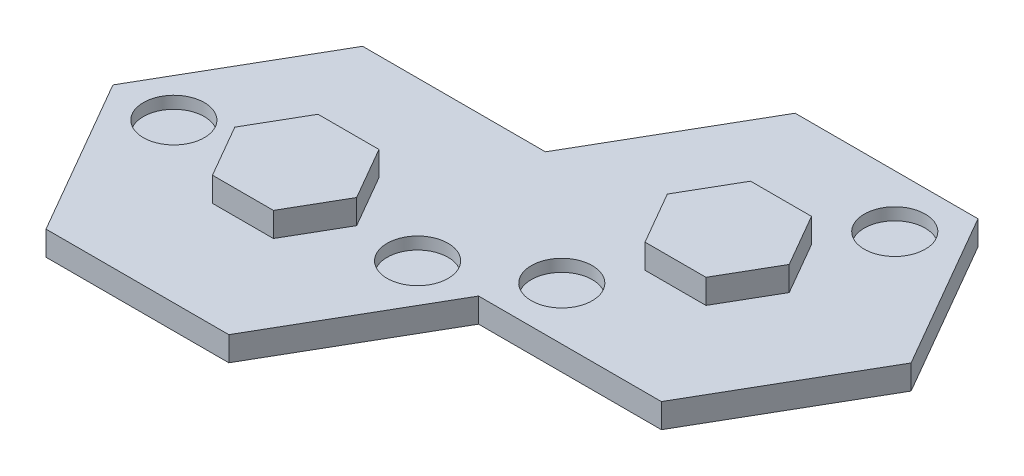
ISO-10303-21;
HEADER;
FILE_DESCRIPTION(('STEP AP214'),'2;1');
FILE_NAME('part.step','',(''),(''),'','','');
FILE_SCHEMA(('AUTOMOTIVE_DESIGN { 1 0 10303 214 1 1 1 1 }'));
ENDSEC;
DATA;
#1=APPLICATION_CONTEXT('core data for automotive mechanical design processes');
#2=APPLICATION_PROTOCOL_DEFINITION('international standard','automotive_design',2000,#1);
#3=PRODUCT_CONTEXT('',#1,'mechanical');
#4=PRODUCT('Part','Part','',(#3));
#5=PRODUCT_RELATED_PRODUCT_CATEGORY('part','',(#4));
#6=PRODUCT_DEFINITION_FORMATION('','',#4);
#7=PRODUCT_DEFINITION_CONTEXT('part definition',#1,'design');
#8=PRODUCT_DEFINITION('design','',#6,#7);
#9=PRODUCT_DEFINITION_SHAPE('','',#8);
#10=(LENGTH_UNIT() NAMED_UNIT(*) SI_UNIT(.MILLI.,.METRE.));
#11=(NAMED_UNIT(*) PLANE_ANGLE_UNIT() SI_UNIT($,.RADIAN.));
#12=(NAMED_UNIT(*) SI_UNIT($,.STERADIAN.) SOLID_ANGLE_UNIT());
#13=UNCERTAINTY_MEASURE_WITH_UNIT(LENGTH_MEASURE(1.E-05),#10,'distance_accuracy_value','');
#14=(GEOMETRIC_REPRESENTATION_CONTEXT(3) GLOBAL_UNCERTAINTY_ASSIGNED_CONTEXT((#13)) GLOBAL_UNIT_ASSIGNED_CONTEXT((#10,
#11,#12)) REPRESENTATION_CONTEXT('',''));
#15=CARTESIAN_POINT('',(0.,0.,0.));
#16=DIRECTION('',(0.,0.,1.));
#17=DIRECTION('',(1.,0.,0.));
#18=AXIS2_PLACEMENT_3D('',#15,#16,#17);
#19=CARTESIAN_POINT('',(0.,10.16,0.));
#20=DIRECTION('',(0.,1.,0.));
#21=DIRECTION('',(0.,0.,1.));
#22=AXIS2_PLACEMENT_3D('',#19,#20,#21);
#23=PLANE('',#22);
#24=DIRECTION('',(-0.500000000000001,0.,-0.866025403784438));
#25=VECTOR('',#24,1.);
#26=CARTESIAN_POINT('',(101.6,10.1600000000002,-43.9940905122495));
#27=LINE('',#26,#25);
#28=CARTESIAN_POINT('',(101.6,10.16,-43.9940905122495));
#29=VERTEX_POINT('',#28);
#30=CARTESIAN_POINT('',(88.9,10.1600000000002,-65.9911357683742));
#31=VERTEX_POINT('',#30);
#32=EDGE_CURVE('E187',#29,#31,#27,.T.);
#33=ORIENTED_EDGE('',*,*,#32,.T.);
#34=DIRECTION('',(0.499999999999999,0.,-0.866025403784439));
#35=VECTOR('',#34,1.);
#36=CARTESIAN_POINT('',(88.9,10.1600000000002,-65.9911357683742));
#37=LINE('',#36,#35);
#38=CARTESIAN_POINT('',(101.6,10.16,-87.9881810244989));
#39=VERTEX_POINT('',#38);
#40=EDGE_CURVE('E202',#31,#39,#37,.T.);
#41=ORIENTED_EDGE('',*,*,#40,.T.);
#42=DIRECTION('',(1.,0.,0.));
#43=VECTOR('',#42,1.);
#44=CARTESIAN_POINT('',(101.6,10.1600000000004,-87.988181024499));
#45=LINE('',#44,#43);
#46=CARTESIAN_POINT('',(127.,10.16,-87.988181024499));
#47=VERTEX_POINT('',#46);
#48=EDGE_CURVE('E222',#39,#47,#45,.T.);
#49=ORIENTED_EDGE('',*,*,#48,.T.);
#50=DIRECTION('',(0.5,0.,0.866025403784438));
#51=VECTOR('',#50,1.);
#52=CARTESIAN_POINT('',(127.,10.1600000000005,-87.988181024499));
#53=LINE('',#52,#51);
#54=CARTESIAN_POINT('',(139.7,10.16,-65.9911357683742));
#55=VERTEX_POINT('',#54);
#56=EDGE_CURVE('E220',#47,#55,#53,.T.);
#57=ORIENTED_EDGE('',*,*,#56,.T.);
#58=DIRECTION('',(-0.499999999999999,0.,0.866025403784439));
#59=VECTOR('',#58,1.);
#60=CARTESIAN_POINT('',(139.7,10.1600000000005,-65.9911357683742));
#61=LINE('',#60,#59);
#62=CARTESIAN_POINT('',(127.,10.16,-43.9940905122495));
#63=VERTEX_POINT('',#62);
#64=EDGE_CURVE('E53',#55,#63,#61,.T.);
#65=ORIENTED_EDGE('',*,*,#64,.T.);
#66=DIRECTION('',(-1.,0.,0.));
#67=VECTOR('',#66,1.);
#68=CARTESIAN_POINT('',(127.,10.1600000000004,-43.9940905122495));
#69=LINE('',#68,#67);
#70=EDGE_CURVE('E48',#63,#29,#69,.T.);
#71=ORIENTED_EDGE('',*,*,#70,.T.);
#72=EDGE_LOOP('',(#33,#41,#49,#57,#65,#71));
#73=FACE_BOUND('',#72,.T.);
#74=CARTESIAN_POINT('',(139.7,10.16,-109.985226280624));
#75=DIRECTION('',(0.,-1.,0.));
#76=DIRECTION('',(0.866025403784439,0.,0.5));
#77=AXIS2_PLACEMENT_3D('',#74,#75,#76);
#78=CIRCLE('',#77,12.7);
#79=CARTESIAN_POINT('',(150.698522628062,10.16,-103.635226280624));
#80=VERTEX_POINT('',#79);
#81=EDGE_CURVE('E283',#80,#80,#78,.T.);
#82=ORIENTED_EDGE('',*,*,#81,.T.);
#83=EDGE_LOOP('',(#82));
#84=FACE_BOUND('',#83,.T.);
#85=CARTESIAN_POINT('',(88.9,10.16,-21.9970452561248));
#86=DIRECTION('',(0.,-1.,0.));
#87=DIRECTION('',(-0.866025403784439,0.,-0.5));
#88=AXIS2_PLACEMENT_3D('',#85,#86,#87);
#89=CIRCLE('',#88,12.7);
#90=CARTESIAN_POINT('',(77.9014773719377,10.16,-28.3470452561248));
#91=VERTEX_POINT('',#90);
#92=EDGE_CURVE('E278',#91,#91,#89,.T.);
#93=ORIENTED_EDGE('',*,*,#92,.T.);
#94=EDGE_LOOP('',(#93));
#95=FACE_BOUND('',#94,.T.);
#96=CARTESIAN_POINT('',(-50.8,10.16,0.));
#97=DIRECTION('',(0.,1.,0.));
#98=DIRECTION('',(0.,0.,1.));
#99=AXIS2_PLACEMENT_3D('',#96,#97,#98);
#100=CIRCLE('',#99,12.7);
#101=CARTESIAN_POINT('',(-50.8,10.16,12.7));
#102=VERTEX_POINT('',#101);
#103=EDGE_CURVE('E333',#102,#102,#100,.T.);
#104=ORIENTED_EDGE('',*,*,#103,.F.);
#105=EDGE_LOOP('',(#104));
#106=FACE_BOUND('',#105,.T.);
#107=CARTESIAN_POINT('',(50.8,10.16,0.));
#108=DIRECTION('',(0.,1.,0.));
#109=DIRECTION('',(0.,0.,-1.));
#110=AXIS2_PLACEMENT_3D('',#107,#108,#109);
#111=CIRCLE('',#110,12.7);
#112=CARTESIAN_POINT('',(50.8,10.16,-12.7));
#113=VERTEX_POINT('',#112);
#114=EDGE_CURVE('E328',#113,#113,#111,.T.);
#115=ORIENTED_EDGE('',*,*,#114,.F.);
#116=EDGE_LOOP('',(#115));
#117=FACE_BOUND('',#116,.T.);
#118=DIRECTION('',(0.5,0.,-0.866025403784439));
#119=VECTOR('',#118,1.);
#120=CARTESIAN_POINT('',(38.1,10.16,65.9911357683742));
#121=LINE('',#120,#119);
#122=CARTESIAN_POINT('',(38.1,10.16,65.9911357683742));
#123=VERTEX_POINT('',#122);
#124=CARTESIAN_POINT('',(76.2,10.16,0.));
#125=VERTEX_POINT('',#124);
#126=EDGE_CURVE('E350',#123,#125,#121,.T.);
#127=ORIENTED_EDGE('',*,*,#126,.T.);
#128=DIRECTION('',(-1.,0.,0.));
#129=VECTOR('',#128,1.);
#130=CARTESIAN_POINT('',(152.4,10.16,0.));
#131=LINE('',#130,#129);
#132=CARTESIAN_POINT('',(152.4,10.16,0.));
#133=VERTEX_POINT('',#132);
#134=EDGE_CURVE('E291',#133,#125,#131,.T.);
#135=ORIENTED_EDGE('',*,*,#134,.F.);
#136=DIRECTION('',(-0.500000000000001,0.,0.866025403784438));
#137=VECTOR('',#136,1.);
#138=CARTESIAN_POINT('',(190.5,10.16,-65.9911357683742));
#139=LINE('',#138,#137);
#140=CARTESIAN_POINT('',(190.5,10.16,-65.9911357683742));
#141=VERTEX_POINT('',#140);
#142=EDGE_CURVE('E294',#141,#133,#139,.T.);
#143=ORIENTED_EDGE('',*,*,#142,.F.);
#144=DIRECTION('',(0.5,0.,0.866025403784439));
#145=VECTOR('',#144,1.);
#146=CARTESIAN_POINT('',(152.4,10.16,-131.982271536748));
#147=LINE('',#146,#145);
#148=CARTESIAN_POINT('',(152.4,10.16,-131.982271536748));
#149=VERTEX_POINT('',#148);
#150=EDGE_CURVE('E298',#149,#141,#147,.T.);
#151=ORIENTED_EDGE('',*,*,#150,.F.);
#152=DIRECTION('',(1.,0.,0.));
#153=VECTOR('',#152,1.);
#154=CARTESIAN_POINT('',(76.2000000000001,10.16,-131.982271536748));
#155=LINE('',#154,#153);
#156=CARTESIAN_POINT('',(76.2000000000001,10.16,-131.982271536748));
#157=VERTEX_POINT('',#156);
#158=EDGE_CURVE('E301',#157,#149,#155,.T.);
#159=ORIENTED_EDGE('',*,*,#158,.F.);
#160=DIRECTION('',(0.5,0.,-0.866025403784438));
#161=VECTOR('',#160,1.);
#162=CARTESIAN_POINT('',(38.1,10.16,-65.9911357683742));
#163=LINE('',#162,#161);
#164=CARTESIAN_POINT('',(38.1,10.16,-65.9911357683742));
#165=VERTEX_POINT('',#164);
#166=EDGE_CURVE('E304',#165,#157,#163,.T.);
#167=ORIENTED_EDGE('',*,*,#166,.F.);
#168=DIRECTION('',(-1.,0.,0.));
#169=VECTOR('',#168,1.);
#170=CARTESIAN_POINT('',(38.1,10.16,-65.9911357683742));
#171=LINE('',#170,#169);
#172=CARTESIAN_POINT('',(-38.1,10.16,-65.9911357683742));
#173=VERTEX_POINT('',#172);
#174=EDGE_CURVE('E341',#165,#173,#171,.T.);
#175=ORIENTED_EDGE('',*,*,#174,.T.);
#176=DIRECTION('',(-0.5,0.,0.866025403784439));
#177=VECTOR('',#176,1.);
#178=CARTESIAN_POINT('',(-38.1,10.16,-65.9911357683742));
#179=LINE('',#178,#177);
#180=CARTESIAN_POINT('',(-76.2,10.16,0.));
#181=VERTEX_POINT('',#180);
#182=EDGE_CURVE('E343',#173,#181,#179,.T.);
#183=ORIENTED_EDGE('',*,*,#182,.T.);
#184=DIRECTION('',(0.5,0.,0.866025403784439));
#185=VECTOR('',#184,1.);
#186=CARTESIAN_POINT('',(-76.2,10.16,0.));
#187=LINE('',#186,#185);
#188=CARTESIAN_POINT('',(-38.1,10.16,65.9911357683742));
#189=VERTEX_POINT('',#188);
#190=EDGE_CURVE('E346',#181,#189,#187,.T.);
#191=ORIENTED_EDGE('',*,*,#190,.T.);
#192=DIRECTION('',(1.,0.,0.));
#193=VECTOR('',#192,1.);
#194=CARTESIAN_POINT('',(-38.1,10.16,65.9911357683742));
#195=LINE('',#194,#193);
#196=EDGE_CURVE('E348',#189,#123,#195,.T.);
#197=ORIENTED_EDGE('',*,*,#196,.T.);
#198=EDGE_LOOP('',(#127,#135,#143,#151,#159,#167,#175,#183,#191,#197));
#199=FACE_BOUND('',#198,.T.);
#200=DIRECTION('',(-1.,0.,0.));
#201=VECTOR('',#200,1.);
#202=CARTESIAN_POINT('',(12.7,10.16,-21.9970452561247));
#203=LINE('',#202,#201);
#204=CARTESIAN_POINT('',(12.7,10.16,-21.9970452561247));
#205=VERTEX_POINT('',#204);
#206=CARTESIAN_POINT('',(-12.7,10.16,-21.9970452561247));
#207=VERTEX_POINT('',#206);
#208=EDGE_CURVE('E253',#205,#207,#203,.T.);
#209=ORIENTED_EDGE('',*,*,#208,.F.);
#210=DIRECTION('',(-0.5,0.,-0.866025403784439));
#211=VECTOR('',#210,1.);
#212=CARTESIAN_POINT('',(25.4,10.16,0.));
#213=LINE('',#212,#211);
#214=CARTESIAN_POINT('',(25.4,10.16,0.));
#215=VERTEX_POINT('',#214);
#216=EDGE_CURVE('E190',#215,#205,#213,.T.);
#217=ORIENTED_EDGE('',*,*,#216,.F.);
#218=DIRECTION('',(0.5,0.,-0.866025403784439));
#219=VECTOR('',#218,1.);
#220=CARTESIAN_POINT('',(12.7,10.16,21.9970452561248));
#221=LINE('',#220,#219);
#222=CARTESIAN_POINT('',(12.7,10.16,21.9970452561248));
#223=VERTEX_POINT('',#222);
#224=EDGE_CURVE('E240',#223,#215,#221,.T.);
#225=ORIENTED_EDGE('',*,*,#224,.F.);
#226=DIRECTION('',(1.,0.,0.));
#227=VECTOR('',#226,1.);
#228=CARTESIAN_POINT('',(-12.7,10.16,21.9970452561247));
#229=LINE('',#228,#227);
#230=CARTESIAN_POINT('',(-12.7,10.16,21.9970452561247));
#231=VERTEX_POINT('',#230);
#232=EDGE_CURVE('E259',#231,#223,#229,.T.);
#233=ORIENTED_EDGE('',*,*,#232,.F.);
#234=DIRECTION('',(0.5,0.,0.866025403784439));
#235=VECTOR('',#234,1.);
#236=CARTESIAN_POINT('',(-25.4,10.16,0.));
#237=LINE('',#236,#235);
#238=CARTESIAN_POINT('',(-25.4,10.16,0.));
#239=VERTEX_POINT('',#238);
#240=EDGE_CURVE('E257',#239,#231,#237,.T.);
#241=ORIENTED_EDGE('',*,*,#240,.F.);
#242=DIRECTION('',(-0.5,0.,0.866025403784439));
#243=VECTOR('',#242,1.);
#244=CARTESIAN_POINT('',(-12.7,10.16,-21.9970452561247));
#245=LINE('',#244,#243);
#246=EDGE_CURVE('E255',#207,#239,#245,.T.);
#247=ORIENTED_EDGE('',*,*,#246,.F.);
#248=EDGE_LOOP('',(#209,#217,#225,#233,#241,#247));
#249=FACE_BOUND('',#248,.T.);
#250=ADVANCED_FACE('F33',(#73,#84,#95,#106,#117,#199,#249),#23,.T.);
#251=CARTESIAN_POINT('',(38.1,10.16,-65.9911357683742));
#252=DIRECTION('',(0.,0.,1.));
#253=DIRECTION('',(1.,0.,0.));
#254=AXIS2_PLACEMENT_3D('',#251,#252,#253);
#255=PLANE('',#254);
#256=DIRECTION('',(-1.,0.,0.));
#257=VECTOR('',#256,1.);
#258=CARTESIAN_POINT('',(38.1,0.,-65.9911357683742));
#259=LINE('',#258,#257);
#260=CARTESIAN_POINT('',(38.1,0.,-65.9911357683742));
#261=VERTEX_POINT('',#260);
#262=CARTESIAN_POINT('',(-38.1,0.,-65.9911357683742));
#263=VERTEX_POINT('',#262);
#264=EDGE_CURVE('E332',#261,#263,#259,.T.);
#265=ORIENTED_EDGE('',*,*,#264,.T.);
#266=DIRECTION('',(0.,-1.,0.));
#267=VECTOR('',#266,1.);
#268=CARTESIAN_POINT('',(-38.1,10.16,-65.9911357683742));
#269=LINE('',#268,#267);
#270=EDGE_CURVE('E41',#173,#263,#269,.T.);
#271=ORIENTED_EDGE('',*,*,#270,.F.);
#272=ORIENTED_EDGE('',*,*,#174,.F.);
#273=DIRECTION('',(0.,-1.,0.));
#274=VECTOR('',#273,1.);
#275=CARTESIAN_POINT('',(38.1,10.16,-65.9911357683742));
#276=LINE('',#275,#274);
#277=EDGE_CURVE('E11',#165,#261,#276,.T.);
#278=ORIENTED_EDGE('',*,*,#277,.T.);
#279=EDGE_LOOP('',(#265,#271,#272,#278));
#280=FACE_BOUND('',#279,.T.);
#281=ADVANCED_FACE('F35',(#280),#255,.F.);
#282=CARTESIAN_POINT('',(-38.1,10.16,-65.9911357683742));
#283=DIRECTION('',(0.866025403784439,0.,0.5));
#284=DIRECTION('',(0.5,0.,-0.866025403784439));
#285=AXIS2_PLACEMENT_3D('',#282,#283,#284);
#286=PLANE('',#285);
#287=DIRECTION('',(-0.5,0.,0.866025403784439));
#288=VECTOR('',#287,1.);
#289=CARTESIAN_POINT('',(-38.1,0.,-65.9911357683742));
#290=LINE('',#289,#288);
#291=CARTESIAN_POINT('',(-76.2,0.,0.));
#292=VERTEX_POINT('',#291);
#293=EDGE_CURVE('E354',#263,#292,#290,.T.);
#294=ORIENTED_EDGE('',*,*,#293,.T.);
#295=DIRECTION('',(0.,-1.,0.));
#296=VECTOR('',#295,1.);
#297=CARTESIAN_POINT('',(-76.2,10.16,0.));
#298=LINE('',#297,#296);
#299=EDGE_CURVE('E369',#181,#292,#298,.T.);
#300=ORIENTED_EDGE('',*,*,#299,.F.);
#301=ORIENTED_EDGE('',*,*,#182,.F.);
#302=ORIENTED_EDGE('',*,*,#270,.T.);
#303=EDGE_LOOP('',(#294,#300,#301,#302));
#304=FACE_BOUND('',#303,.T.);
#305=ADVANCED_FACE('F376',(#304),#286,.F.);
#306=CARTESIAN_POINT('',(-76.2,10.16,0.));
#307=DIRECTION('',(0.866025403784439,0.,-0.5));
#308=DIRECTION('',(-0.5,0.,-0.866025403784439));
#309=AXIS2_PLACEMENT_3D('',#306,#307,#308);
#310=PLANE('',#309);
#311=DIRECTION('',(0.5,0.,0.866025403784439));
#312=VECTOR('',#311,1.);
#313=CARTESIAN_POINT('',(-76.2,0.,0.));
#314=LINE('',#313,#312);
#315=CARTESIAN_POINT('',(-38.1,0.,65.9911357683742));
#316=VERTEX_POINT('',#315);
#317=EDGE_CURVE('E356',#292,#316,#314,.T.);
#318=ORIENTED_EDGE('',*,*,#317,.T.);
#319=DIRECTION('',(0.,-1.,0.));
#320=VECTOR('',#319,1.);
#321=CARTESIAN_POINT('',(-38.1,10.16,65.9911357683742));
#322=LINE('',#321,#320);
#323=EDGE_CURVE('E366',#189,#316,#322,.T.);
#324=ORIENTED_EDGE('',*,*,#323,.F.);
#325=ORIENTED_EDGE('',*,*,#190,.F.);
#326=ORIENTED_EDGE('',*,*,#299,.T.);
#327=EDGE_LOOP('',(#318,#324,#325,#326));
#328=FACE_BOUND('',#327,.T.);
#329=ADVANCED_FACE('F386',(#328),#310,.F.);
#330=CARTESIAN_POINT('',(-38.1,10.16,65.9911357683742));
#331=DIRECTION('',(0.,0.,-1.));
#332=DIRECTION('',(-1.,0.,0.));
#333=AXIS2_PLACEMENT_3D('',#330,#331,#332);
#334=PLANE('',#333);
#335=DIRECTION('',(1.,0.,0.));
#336=VECTOR('',#335,1.);
#337=CARTESIAN_POINT('',(-38.1,0.,65.9911357683742));
#338=LINE('',#337,#336);
#339=CARTESIAN_POINT('',(38.1,0.,65.9911357683742));
#340=VERTEX_POINT('',#339);
#341=EDGE_CURVE('E358',#316,#340,#338,.T.);
#342=ORIENTED_EDGE('',*,*,#341,.T.);
#343=DIRECTION('',(0.,-1.,0.));
#344=VECTOR('',#343,1.);
#345=CARTESIAN_POINT('',(38.1,10.16,65.9911357683742));
#346=LINE('',#345,#344);
#347=EDGE_CURVE('E363',#123,#340,#346,.T.);
#348=ORIENTED_EDGE('',*,*,#347,.F.);
#349=ORIENTED_EDGE('',*,*,#196,.F.);
#350=ORIENTED_EDGE('',*,*,#323,.T.);
#351=EDGE_LOOP('',(#342,#348,#349,#350));
#352=FACE_BOUND('',#351,.T.);
#353=ADVANCED_FACE('F390',(#352),#334,.F.);
#354=CARTESIAN_POINT('',(38.1,10.16,65.9911357683742));
#355=DIRECTION('',(-0.866025403784439,0.,-0.5));
#356=DIRECTION('',(-0.5,0.,0.866025403784439));
#357=AXIS2_PLACEMENT_3D('',#354,#355,#356);
#358=PLANE('',#357);
#359=DIRECTION('',(0.5,0.,-0.866025403784439));
#360=VECTOR('',#359,1.);
#361=CARTESIAN_POINT('',(38.1,0.,65.9911357683742));
#362=LINE('',#361,#360);
#363=CARTESIAN_POINT('',(76.2,0.,0.));
#364=VERTEX_POINT('',#363);
#365=EDGE_CURVE('E344',#340,#364,#362,.T.);
#366=ORIENTED_EDGE('',*,*,#365,.T.);
#367=DIRECTION('',(0.,-1.,0.));
#368=VECTOR('',#367,1.);
#369=CARTESIAN_POINT('',(76.2,10.16,0.));
#370=LINE('',#369,#368);
#371=EDGE_CURVE('E352',#125,#364,#370,.T.);
#372=ORIENTED_EDGE('',*,*,#371,.F.);
#373=ORIENTED_EDGE('',*,*,#126,.F.);
#374=ORIENTED_EDGE('',*,*,#347,.T.);
#375=EDGE_LOOP('',(#366,#372,#373,#374));
#376=FACE_BOUND('',#375,.T.);
#377=ADVANCED_FACE('F418',(#376),#358,.F.);
#378=CARTESIAN_POINT('',(0.,0.,0.));
#379=DIRECTION('',(0.,1.,0.));
#380=DIRECTION('',(0.,0.,1.));
#381=AXIS2_PLACEMENT_3D('',#378,#379,#380);
#382=PLANE('',#381);
#383=ORIENTED_EDGE('',*,*,#264,.F.);
#384=DIRECTION('',(0.5,0.,-0.866025403784438));
#385=VECTOR('',#384,1.);
#386=CARTESIAN_POINT('',(38.1,0.,-65.9911357683742));
#387=LINE('',#386,#385);
#388=CARTESIAN_POINT('',(76.2000000000001,0.,-131.982271536748));
#389=VERTEX_POINT('',#388);
#390=EDGE_CURVE('E295',#261,#389,#387,.T.);
#391=ORIENTED_EDGE('',*,*,#390,.T.);
#392=DIRECTION('',(1.,0.,0.));
#393=VECTOR('',#392,1.);
#394=CARTESIAN_POINT('',(76.2000000000001,0.,-131.982271536748));
#395=LINE('',#394,#393);
#396=CARTESIAN_POINT('',(152.4,0.,-131.982271536748));
#397=VERTEX_POINT('',#396);
#398=EDGE_CURVE('E316',#389,#397,#395,.T.);
#399=ORIENTED_EDGE('',*,*,#398,.T.);
#400=DIRECTION('',(0.5,0.,0.866025403784439));
#401=VECTOR('',#400,1.);
#402=CARTESIAN_POINT('',(152.4,0.,-131.982271536748));
#403=LINE('',#402,#401);
#404=CARTESIAN_POINT('',(190.5,0.,-65.9911357683742));
#405=VERTEX_POINT('',#404);
#406=EDGE_CURVE('E313',#397,#405,#403,.T.);
#407=ORIENTED_EDGE('',*,*,#406,.T.);
#408=DIRECTION('',(-0.500000000000001,0.,0.866025403784438));
#409=VECTOR('',#408,1.);
#410=CARTESIAN_POINT('',(190.5,0.,-65.9911357683742));
#411=LINE('',#410,#409);
#412=CARTESIAN_POINT('',(152.4,0.,0.));
#413=VERTEX_POINT('',#412);
#414=EDGE_CURVE('E310',#405,#413,#411,.T.);
#415=ORIENTED_EDGE('',*,*,#414,.T.);
#416=DIRECTION('',(-1.,0.,0.));
#417=VECTOR('',#416,1.);
#418=CARTESIAN_POINT('',(152.4,0.,0.));
#419=LINE('',#418,#417);
#420=EDGE_CURVE('E282',#413,#364,#419,.T.);
#421=ORIENTED_EDGE('',*,*,#420,.T.);
#422=ORIENTED_EDGE('',*,*,#365,.F.);
#423=ORIENTED_EDGE('',*,*,#341,.F.);
#424=ORIENTED_EDGE('',*,*,#317,.F.);
#425=ORIENTED_EDGE('',*,*,#293,.F.);
#426=EDGE_LOOP('',(#383,#391,#399,#407,#415,#421,#422,#423,#424,#425));
#427=FACE_BOUND('',#426,.T.);
#428=ADVANCED_FACE('F381',(#427),#382,.F.);
#429=CARTESIAN_POINT('',(50.8,5.08,0.));
#430=DIRECTION('',(0.,1.,0.));
#431=DIRECTION('',(0.,0.,1.));
#432=AXIS2_PLACEMENT_3D('',#429,#430,#431);
#433=CYLINDRICAL_SURFACE('',#432,12.7);
#434=CARTESIAN_POINT('',(50.8,5.08,0.));
#435=DIRECTION('',(0.,1.,0.));
#436=DIRECTION('',(0.,0.,-1.));
#437=AXIS2_PLACEMENT_3D('',#434,#435,#436);
#438=CIRCLE('',#437,12.7);
#439=CARTESIAN_POINT('',(50.8,5.08,-12.7));
#440=VERTEX_POINT('',#439);
#441=EDGE_CURVE('E336',#440,#440,#438,.T.);
#442=ORIENTED_EDGE('',*,*,#441,.F.);
#443=EDGE_LOOP('',(#442));
#444=FACE_BOUND('',#443,.T.);
#445=ORIENTED_EDGE('',*,*,#114,.T.);
#446=EDGE_LOOP('',(#445));
#447=FACE_BOUND('',#446,.T.);
#448=ADVANCED_FACE('F425',(#444,#447),#433,.F.);
#449=CARTESIAN_POINT('',(50.8,5.08,0.));
#450=DIRECTION('',(0.,-1.,0.));
#451=DIRECTION('',(0.,0.,-1.));
#452=AXIS2_PLACEMENT_3D('',#449,#450,#451);
#453=PLANE('',#452);
#454=ORIENTED_EDGE('',*,*,#441,.T.);
#455=EDGE_LOOP('',(#454));
#456=FACE_BOUND('',#455,.T.);
#457=ADVANCED_FACE('F437',(#456),#453,.F.);
#458=CARTESIAN_POINT('',(-50.8,5.08,0.));
#459=DIRECTION('',(0.,1.,0.));
#460=DIRECTION('',(0.,0.,1.));
#461=AXIS2_PLACEMENT_3D('',#458,#459,#460);
#462=CYLINDRICAL_SURFACE('',#461,12.7);
#463=CARTESIAN_POINT('',(-50.8,5.08,0.));
#464=DIRECTION('',(0.,1.,0.));
#465=DIRECTION('',(0.,0.,1.));
#466=AXIS2_PLACEMENT_3D('',#463,#464,#465);
#467=CIRCLE('',#466,12.7);
#468=CARTESIAN_POINT('',(-50.8,5.08,12.7));
#469=VERTEX_POINT('',#468);
#470=EDGE_CURVE('E329',#469,#469,#467,.T.);
#471=ORIENTED_EDGE('',*,*,#470,.F.);
#472=EDGE_LOOP('',(#471));
#473=FACE_BOUND('',#472,.T.);
#474=ORIENTED_EDGE('',*,*,#103,.T.);
#475=EDGE_LOOP('',(#474));
#476=FACE_BOUND('',#475,.T.);
#477=ADVANCED_FACE('F441',(#473,#476),#462,.F.);
#478=CARTESIAN_POINT('',(-50.8,5.08,0.));
#479=DIRECTION('',(0.,1.,0.));
#480=DIRECTION('',(0.,0.,1.));
#481=AXIS2_PLACEMENT_3D('',#478,#479,#480);
#482=PLANE('',#481);
#483=ORIENTED_EDGE('',*,*,#470,.T.);
#484=EDGE_LOOP('',(#483));
#485=FACE_BOUND('',#484,.T.);
#486=ADVANCED_FACE('F445',(#485),#482,.T.);
#487=CARTESIAN_POINT('',(152.4,10.16,0.));
#488=DIRECTION('',(0.,0.,1.));
#489=DIRECTION('',(1.,0.,0.));
#490=AXIS2_PLACEMENT_3D('',#487,#488,#489);
#491=PLANE('',#490);
#492=ORIENTED_EDGE('',*,*,#420,.F.);
#493=DIRECTION('',(0.,-1.,0.));
#494=VECTOR('',#493,1.);
#495=CARTESIAN_POINT('',(152.4,10.16,0.));
#496=LINE('',#495,#494);
#497=EDGE_CURVE('E326',#133,#413,#496,.T.);
#498=ORIENTED_EDGE('',*,*,#497,.F.);
#499=ORIENTED_EDGE('',*,*,#134,.T.);
#500=ORIENTED_EDGE('',*,*,#371,.T.);
#501=EDGE_LOOP('',(#492,#498,#499,#500));
#502=FACE_BOUND('',#501,.T.);
#503=ADVANCED_FACE('F416',(#502),#491,.T.);
#504=CARTESIAN_POINT('',(190.5,10.16,-65.9911357683742));
#505=DIRECTION('',(0.866025403784438,0.,0.500000000000001));
#506=DIRECTION('',(0.500000000000001,0.,-0.866025403784438));
#507=AXIS2_PLACEMENT_3D('',#504,#505,#506);
#508=PLANE('',#507);
#509=ORIENTED_EDGE('',*,*,#414,.F.);
#510=DIRECTION('',(0.,-1.,0.));
#511=VECTOR('',#510,1.);
#512=CARTESIAN_POINT('',(190.5,10.16,-65.9911357683742));
#513=LINE('',#512,#511);
#514=EDGE_CURVE('E324',#141,#405,#513,.T.);
#515=ORIENTED_EDGE('',*,*,#514,.F.);
#516=ORIENTED_EDGE('',*,*,#142,.T.);
#517=ORIENTED_EDGE('',*,*,#497,.T.);
#518=EDGE_LOOP('',(#509,#515,#516,#517));
#519=FACE_BOUND('',#518,.T.);
#520=ADVANCED_FACE('F413',(#519),#508,.T.);
#521=CARTESIAN_POINT('',(152.4,10.16,-131.982271536748));
#522=DIRECTION('',(0.866025403784439,0.,-0.5));
#523=DIRECTION('',(-0.5,0.,-0.866025403784439));
#524=AXIS2_PLACEMENT_3D('',#521,#522,#523);
#525=PLANE('',#524);
#526=ORIENTED_EDGE('',*,*,#406,.F.);
#527=DIRECTION('',(0.,-1.,0.));
#528=VECTOR('',#527,1.);
#529=CARTESIAN_POINT('',(152.4,10.16,-131.982271536748));
#530=LINE('',#529,#528);
#531=EDGE_CURVE('E322',#149,#397,#530,.T.);
#532=ORIENTED_EDGE('',*,*,#531,.F.);
#533=ORIENTED_EDGE('',*,*,#150,.T.);
#534=ORIENTED_EDGE('',*,*,#514,.T.);
#535=EDGE_LOOP('',(#526,#532,#533,#534));
#536=FACE_BOUND('',#535,.T.);
#537=ADVANCED_FACE('F409',(#536),#525,.T.);
#538=CARTESIAN_POINT('',(76.2000000000001,10.16,-131.982271536748));
#539=DIRECTION('',(0.,0.,-1.));
#540=DIRECTION('',(-1.,0.,0.));
#541=AXIS2_PLACEMENT_3D('',#538,#539,#540);
#542=PLANE('',#541);
#543=ORIENTED_EDGE('',*,*,#398,.F.);
#544=DIRECTION('',(0.,-1.,0.));
#545=VECTOR('',#544,1.);
#546=CARTESIAN_POINT('',(76.2000000000001,10.16,-131.982271536748));
#547=LINE('',#546,#545);
#548=EDGE_CURVE('E307',#157,#389,#547,.T.);
#549=ORIENTED_EDGE('',*,*,#548,.F.);
#550=ORIENTED_EDGE('',*,*,#158,.T.);
#551=ORIENTED_EDGE('',*,*,#531,.T.);
#552=EDGE_LOOP('',(#543,#549,#550,#551));
#553=FACE_BOUND('',#552,.T.);
#554=ADVANCED_FACE('F406',(#553),#542,.T.);
#555=CARTESIAN_POINT('',(38.1,10.16,-65.9911357683742));
#556=DIRECTION('',(-0.866025403784438,0.,-0.5));
#557=DIRECTION('',(-0.5,0.,0.866025403784438));
#558=AXIS2_PLACEMENT_3D('',#555,#556,#557);
#559=PLANE('',#558);
#560=ORIENTED_EDGE('',*,*,#390,.F.);
#561=ORIENTED_EDGE('',*,*,#277,.F.);
#562=ORIENTED_EDGE('',*,*,#166,.T.);
#563=ORIENTED_EDGE('',*,*,#548,.T.);
#564=EDGE_LOOP('',(#560,#561,#562,#563));
#565=FACE_BOUND('',#564,.T.);
#566=ADVANCED_FACE('F402',(#565),#559,.T.);
#567=CARTESIAN_POINT('',(88.9,5.08,-21.9970452561248));
#568=DIRECTION('',(0.,1.,0.));
#569=DIRECTION('',(0.,0.,1.));
#570=AXIS2_PLACEMENT_3D('',#567,#568,#569);
#571=CYLINDRICAL_SURFACE('',#570,12.7);
#572=CARTESIAN_POINT('',(88.9,5.08,-21.9970452561248));
#573=DIRECTION('',(0.,-1.,0.));
#574=DIRECTION('',(-0.866025403784439,0.,-0.5));
#575=AXIS2_PLACEMENT_3D('',#572,#573,#574);
#576=CIRCLE('',#575,12.7);
#577=CARTESIAN_POINT('',(77.9014773719377,5.08,-28.3470452561248));
#578=VERTEX_POINT('',#577);
#579=EDGE_CURVE('E286',#578,#578,#576,.T.);
#580=ORIENTED_EDGE('',*,*,#579,.T.);
#581=EDGE_LOOP('',(#580));
#582=FACE_BOUND('',#581,.T.);
#583=ORIENTED_EDGE('',*,*,#92,.F.);
#584=EDGE_LOOP('',(#583));
#585=FACE_BOUND('',#584,.T.);
#586=ADVANCED_FACE('F460',(#582,#585),#571,.F.);
#587=CARTESIAN_POINT('',(88.9,5.08,-21.9970452561248));
#588=DIRECTION('',(0.,-1.,0.));
#589=DIRECTION('',(-0.866025403784439,0.,-0.5));
#590=AXIS2_PLACEMENT_3D('',#587,#588,#589);
#591=PLANE('',#590);
#592=ORIENTED_EDGE('',*,*,#579,.F.);
#593=EDGE_LOOP('',(#592));
#594=FACE_BOUND('',#593,.T.);
#595=ADVANCED_FACE('F463',(#594),#591,.F.);
#596=CARTESIAN_POINT('',(139.7,5.08,-109.985226280624));
#597=DIRECTION('',(0.,1.,0.));
#598=DIRECTION('',(0.,0.,1.));
#599=AXIS2_PLACEMENT_3D('',#596,#597,#598);
#600=CYLINDRICAL_SURFACE('',#599,12.7);
#601=CARTESIAN_POINT('',(139.7,5.08,-109.985226280624));
#602=DIRECTION('',(0.,-1.,0.));
#603=DIRECTION('',(0.866025403784439,0.,0.5));
#604=AXIS2_PLACEMENT_3D('',#601,#602,#603);
#605=CIRCLE('',#604,12.7);
#606=CARTESIAN_POINT('',(150.698522628062,5.08,-103.635226280624));
#607=VERTEX_POINT('',#606);
#608=EDGE_CURVE('E279',#607,#607,#605,.T.);
#609=ORIENTED_EDGE('',*,*,#608,.T.);
#610=EDGE_LOOP('',(#609));
#611=FACE_BOUND('',#610,.T.);
#612=ORIENTED_EDGE('',*,*,#81,.F.);
#613=EDGE_LOOP('',(#612));
#614=FACE_BOUND('',#613,.T.);
#615=ADVANCED_FACE('F467',(#611,#614),#600,.F.);
#616=CARTESIAN_POINT('',(139.7,5.08,-109.985226280624));
#617=DIRECTION('',(0.,1.,0.));
#618=DIRECTION('',(0.866025403784439,0.,0.5));
#619=AXIS2_PLACEMENT_3D('',#616,#617,#618);
#620=PLANE('',#619);
#621=ORIENTED_EDGE('',*,*,#608,.F.);
#622=EDGE_LOOP('',(#621));
#623=FACE_BOUND('',#622,.T.);
#624=ADVANCED_FACE('F471',(#623),#620,.T.);
#625=CARTESIAN_POINT('',(25.4,20.32,0.));
#626=DIRECTION('',(-0.866025403784439,0.,0.5));
#627=DIRECTION('',(0.5,0.,0.866025403784439));
#628=AXIS2_PLACEMENT_3D('',#625,#626,#627);
#629=PLANE('',#628);
#630=ORIENTED_EDGE('',*,*,#216,.T.);
#631=DIRECTION('',(0.,-1.,0.));
#632=VECTOR('',#631,1.);
#633=CARTESIAN_POINT('',(12.7,20.32,-21.9970452561247));
#634=LINE('',#633,#632);
#635=CARTESIAN_POINT('',(12.7,20.32,-21.9970452561247));
#636=VERTEX_POINT('',#635);
#637=EDGE_CURVE('E276',#636,#205,#634,.T.);
#638=ORIENTED_EDGE('',*,*,#637,.F.);
#639=DIRECTION('',(-0.5,0.,-0.866025403784439));
#640=VECTOR('',#639,1.);
#641=CARTESIAN_POINT('',(25.4,20.32,0.));
#642=LINE('',#641,#640);
#643=CARTESIAN_POINT('',(25.4,20.32,0.));
#644=VERTEX_POINT('',#643);
#645=EDGE_CURVE('E236',#644,#636,#642,.T.);
#646=ORIENTED_EDGE('',*,*,#645,.F.);
#647=DIRECTION('',(0.,-1.,0.));
#648=VECTOR('',#647,1.);
#649=CARTESIAN_POINT('',(25.4,20.32,0.));
#650=LINE('',#649,#648);
#651=EDGE_CURVE('E250',#644,#215,#650,.T.);
#652=ORIENTED_EDGE('',*,*,#651,.T.);
#653=EDGE_LOOP('',(#630,#638,#646,#652));
#654=FACE_BOUND('',#653,.T.);
#655=ADVANCED_FACE('F475',(#654),#629,.F.);
#656=CARTESIAN_POINT('',(12.7,20.32,-21.9970452561247));
#657=DIRECTION('',(0.,0.,1.));
#658=DIRECTION('',(1.,0.,0.));
#659=AXIS2_PLACEMENT_3D('',#656,#657,#658);
#660=PLANE('',#659);
#661=ORIENTED_EDGE('',*,*,#208,.T.);
#662=DIRECTION('',(0.,-1.,0.));
#663=VECTOR('',#662,1.);
#664=CARTESIAN_POINT('',(-12.7,20.32,-21.9970452561247));
#665=LINE('',#664,#663);
#666=CARTESIAN_POINT('',(-12.7,20.32,-21.9970452561247));
#667=VERTEX_POINT('',#666);
#668=EDGE_CURVE('E273',#667,#207,#665,.T.);
#669=ORIENTED_EDGE('',*,*,#668,.F.);
#670=DIRECTION('',(-1.,0.,0.));
#671=VECTOR('',#670,1.);
#672=CARTESIAN_POINT('',(12.7,20.32,-21.9970452561247));
#673=LINE('',#672,#671);
#674=EDGE_CURVE('E239',#636,#667,#673,.T.);
#675=ORIENTED_EDGE('',*,*,#674,.F.);
#676=ORIENTED_EDGE('',*,*,#637,.T.);
#677=EDGE_LOOP('',(#661,#669,#675,#676));
#678=FACE_BOUND('',#677,.T.);
#679=ADVANCED_FACE('F479',(#678),#660,.F.);
#680=CARTESIAN_POINT('',(-12.7,20.32,-21.9970452561247));
#681=DIRECTION('',(0.866025403784439,0.,0.5));
#682=DIRECTION('',(0.5,0.,-0.866025403784439));
#683=AXIS2_PLACEMENT_3D('',#680,#681,#682);
#684=PLANE('',#683);
#685=ORIENTED_EDGE('',*,*,#246,.T.);
#686=DIRECTION('',(0.,-1.,0.));
#687=VECTOR('',#686,1.);
#688=CARTESIAN_POINT('',(-25.4,20.32,0.));
#689=LINE('',#688,#687);
#690=CARTESIAN_POINT('',(-25.4,20.32,0.));
#691=VERTEX_POINT('',#690);
#692=EDGE_CURVE('E270',#691,#239,#689,.T.);
#693=ORIENTED_EDGE('',*,*,#692,.F.);
#694=DIRECTION('',(-0.5,0.,0.866025403784439));
#695=VECTOR('',#694,1.);
#696=CARTESIAN_POINT('',(-12.7,20.32,-21.9970452561247));
#697=LINE('',#696,#695);
#698=EDGE_CURVE('E242',#667,#691,#697,.T.);
#699=ORIENTED_EDGE('',*,*,#698,.F.);
#700=ORIENTED_EDGE('',*,*,#668,.T.);
#701=EDGE_LOOP('',(#685,#693,#699,#700));
#702=FACE_BOUND('',#701,.T.);
#703=ADVANCED_FACE('F483',(#702),#684,.F.);
#704=CARTESIAN_POINT('',(-25.4,20.32,0.));
#705=DIRECTION('',(0.866025403784439,0.,-0.5));
#706=DIRECTION('',(-0.5,0.,-0.866025403784439));
#707=AXIS2_PLACEMENT_3D('',#704,#705,#706);
#708=PLANE('',#707);
#709=ORIENTED_EDGE('',*,*,#240,.T.);
#710=DIRECTION('',(0.,-1.,0.));
#711=VECTOR('',#710,1.);
#712=CARTESIAN_POINT('',(-12.7,20.32,21.9970452561247));
#713=LINE('',#712,#711);
#714=CARTESIAN_POINT('',(-12.7,20.32,21.9970452561247));
#715=VERTEX_POINT('',#714);
#716=EDGE_CURVE('E267',#715,#231,#713,.T.);
#717=ORIENTED_EDGE('',*,*,#716,.F.);
#718=DIRECTION('',(0.5,0.,0.866025403784439));
#719=VECTOR('',#718,1.);
#720=CARTESIAN_POINT('',(-25.4,20.32,0.));
#721=LINE('',#720,#719);
#722=EDGE_CURVE('E244',#691,#715,#721,.T.);
#723=ORIENTED_EDGE('',*,*,#722,.F.);
#724=ORIENTED_EDGE('',*,*,#692,.T.);
#725=EDGE_LOOP('',(#709,#717,#723,#724));
#726=FACE_BOUND('',#725,.T.);
#727=ADVANCED_FACE('F487',(#726),#708,.F.);
#728=CARTESIAN_POINT('',(-12.7,20.32,21.9970452561247));
#729=DIRECTION('',(0.,0.,-1.));
#730=DIRECTION('',(-1.,0.,0.));
#731=AXIS2_PLACEMENT_3D('',#728,#729,#730);
#732=PLANE('',#731);
#733=ORIENTED_EDGE('',*,*,#232,.T.);
#734=DIRECTION('',(0.,-1.,0.));
#735=VECTOR('',#734,1.);
#736=CARTESIAN_POINT('',(12.7,20.32,21.9970452561248));
#737=LINE('',#736,#735);
#738=CARTESIAN_POINT('',(12.7,20.32,21.9970452561248));
#739=VERTEX_POINT('',#738);
#740=EDGE_CURVE('E265',#739,#223,#737,.T.);
#741=ORIENTED_EDGE('',*,*,#740,.F.);
#742=DIRECTION('',(1.,0.,0.));
#743=VECTOR('',#742,1.);
#744=CARTESIAN_POINT('',(-12.7,20.32,21.9970452561247));
#745=LINE('',#744,#743);
#746=EDGE_CURVE('E246',#715,#739,#745,.T.);
#747=ORIENTED_EDGE('',*,*,#746,.F.);
#748=ORIENTED_EDGE('',*,*,#716,.T.);
#749=EDGE_LOOP('',(#733,#741,#747,#748));
#750=FACE_BOUND('',#749,.T.);
#751=ADVANCED_FACE('F491',(#750),#732,.F.);
#752=CARTESIAN_POINT('',(12.7,20.32,21.9970452561248));
#753=DIRECTION('',(-0.866025403784438,0.,-0.5));
#754=DIRECTION('',(-0.5,0.,0.866025403784439));
#755=AXIS2_PLACEMENT_3D('',#752,#753,#754);
#756=PLANE('',#755);
#757=ORIENTED_EDGE('',*,*,#224,.T.);
#758=ORIENTED_EDGE('',*,*,#651,.F.);
#759=DIRECTION('',(0.5,0.,-0.866025403784439));
#760=VECTOR('',#759,1.);
#761=CARTESIAN_POINT('',(12.7,20.32,21.9970452561248));
#762=LINE('',#761,#760);
#763=EDGE_CURVE('E248',#739,#644,#762,.T.);
#764=ORIENTED_EDGE('',*,*,#763,.F.);
#765=ORIENTED_EDGE('',*,*,#740,.T.);
#766=EDGE_LOOP('',(#757,#758,#764,#765));
#767=FACE_BOUND('',#766,.T.);
#768=ADVANCED_FACE('F495',(#767),#756,.F.);
#769=CARTESIAN_POINT('',(0.,20.32,0.));
#770=DIRECTION('',(0.,1.,0.));
#771=DIRECTION('',(0.,0.,1.));
#772=AXIS2_PLACEMENT_3D('',#769,#770,#771);
#773=PLANE('',#772);
#774=ORIENTED_EDGE('',*,*,#645,.T.);
#775=ORIENTED_EDGE('',*,*,#674,.T.);
#776=ORIENTED_EDGE('',*,*,#698,.T.);
#777=ORIENTED_EDGE('',*,*,#722,.T.);
#778=ORIENTED_EDGE('',*,*,#746,.T.);
#779=ORIENTED_EDGE('',*,*,#763,.T.);
#780=EDGE_LOOP('',(#774,#775,#776,#777,#778,#779));
#781=FACE_BOUND('',#780,.T.);
#782=ADVANCED_FACE('F499',(#781),#773,.T.);
#783=CARTESIAN_POINT('',(101.6,20.3200000000002,-43.9940905122495));
#784=DIRECTION('',(-0.866025403784438,0.,0.500000000000001));
#785=DIRECTION('',(0.500000000000001,0.,0.866025403784438));
#786=AXIS2_PLACEMENT_3D('',#783,#784,#785);
#787=PLANE('',#786);
#788=ORIENTED_EDGE('',*,*,#32,.F.);
#789=DIRECTION('',(0.,-1.,0.));
#790=VECTOR('',#789,1.);
#791=CARTESIAN_POINT('',(101.6,20.3200000000002,-43.9940905122495));
#792=LINE('',#791,#790);
#793=CARTESIAN_POINT('',(101.6,20.3200000000002,-43.9940905122495));
#794=VERTEX_POINT('',#793);
#795=EDGE_CURVE('E181',#794,#29,#792,.T.);
#796=ORIENTED_EDGE('',*,*,#795,.F.);
#797=DIRECTION('',(-0.500000000000001,0.,-0.866025403784438));
#798=VECTOR('',#797,1.);
#799=CARTESIAN_POINT('',(101.6,20.3200000000002,-43.9940905122495));
#800=LINE('',#799,#798);
#801=CARTESIAN_POINT('',(88.8999999999999,20.3200000000002,-65.9911357683742));
#802=VERTEX_POINT('',#801);
#803=EDGE_CURVE('E185',#794,#802,#800,.T.);
#804=ORIENTED_EDGE('',*,*,#803,.T.);
#805=DIRECTION('',(0.,-1.,0.));
#806=VECTOR('',#805,1.);
#807=CARTESIAN_POINT('',(88.8999999999999,20.3200000000002,-65.9911357683742));
#808=LINE('',#807,#806);
#809=EDGE_CURVE('E216',#802,#31,#808,.T.);
#810=ORIENTED_EDGE('',*,*,#809,.T.);
#811=EDGE_LOOP('',(#788,#796,#804,#810));
#812=FACE_BOUND('',#811,.T.);
#813=ADVANCED_FACE('F183',(#812),#787,.T.);
#814=CARTESIAN_POINT('',(127.,20.3200000000004,-43.9940905122495));
#815=DIRECTION('',(0.,0.,1.));
#816=DIRECTION('',(0.,-1.,0.));
#817=AXIS2_PLACEMENT_3D('',#814,#815,#816);
#818=PLANE('',#817);
#819=ORIENTED_EDGE('',*,*,#70,.F.);
#820=DIRECTION('',(0.,-1.,0.));
#821=VECTOR('',#820,1.);
#822=CARTESIAN_POINT('',(127.,20.3200000000004,-43.9940905122495));
#823=LINE('',#822,#821);
#824=CARTESIAN_POINT('',(127.,20.3200000000004,-43.9940905122495));
#825=VERTEX_POINT('',#824);
#826=EDGE_CURVE('E191',#825,#63,#823,.T.);
#827=ORIENTED_EDGE('',*,*,#826,.F.);
#828=DIRECTION('',(-1.,0.,0.));
#829=VECTOR('',#828,1.);
#830=CARTESIAN_POINT('',(127.,20.3200000000004,-43.9940905122495));
#831=LINE('',#830,#829);
#832=EDGE_CURVE('E197',#825,#794,#831,.T.);
#833=ORIENTED_EDGE('',*,*,#832,.T.);
#834=ORIENTED_EDGE('',*,*,#795,.T.);
#835=EDGE_LOOP('',(#819,#827,#833,#834));
#836=FACE_BOUND('',#835,.T.);
#837=ADVANCED_FACE('F204',(#836),#818,.T.);
#838=CARTESIAN_POINT('',(139.7,20.3200000000005,-65.9911357683742));
#839=DIRECTION('',(0.866025403784439,0.,0.499999999999999));
#840=DIRECTION('',(0.5,0.,-0.866025403784439));
#841=AXIS2_PLACEMENT_3D('',#838,#839,#840);
#842=PLANE('',#841);
#843=ORIENTED_EDGE('',*,*,#64,.F.);
#844=DIRECTION('',(0.,-1.,0.));
#845=VECTOR('',#844,1.);
#846=CARTESIAN_POINT('',(139.7,20.3200000000005,-65.9911357683742));
#847=LINE('',#846,#845);
#848=CARTESIAN_POINT('',(139.7,20.3200000000005,-65.9911357683742));
#849=VERTEX_POINT('',#848);
#850=EDGE_CURVE('E232',#849,#55,#847,.T.);
#851=ORIENTED_EDGE('',*,*,#850,.F.);
#852=DIRECTION('',(-0.499999999999999,0.,0.866025403784439));
#853=VECTOR('',#852,1.);
#854=CARTESIAN_POINT('',(139.7,20.3200000000005,-65.9911357683742));
#855=LINE('',#854,#853);
#856=EDGE_CURVE('E205',#849,#825,#855,.T.);
#857=ORIENTED_EDGE('',*,*,#856,.T.);
#858=ORIENTED_EDGE('',*,*,#826,.T.);
#859=EDGE_LOOP('',(#843,#851,#857,#858));
#860=FACE_BOUND('',#859,.T.);
#861=ADVANCED_FACE('F508',(#860),#842,.T.);
#862=CARTESIAN_POINT('',(127.,20.3200000000005,-87.9881810244989));
#863=DIRECTION('',(0.866025403784438,0.,-0.5));
#864=DIRECTION('',(-0.5,0.,-0.866025403784438));
#865=AXIS2_PLACEMENT_3D('',#862,#863,#864);
#866=PLANE('',#865);
#867=ORIENTED_EDGE('',*,*,#56,.F.);
#868=DIRECTION('',(0.,-1.,0.));
#869=VECTOR('',#868,1.);
#870=CARTESIAN_POINT('',(127.,20.3200000000005,-87.9881810244989));
#871=LINE('',#870,#869);
#872=CARTESIAN_POINT('',(127.,20.3200000000005,-87.9881810244989));
#873=VERTEX_POINT('',#872);
#874=EDGE_CURVE('E229',#873,#47,#871,.T.);
#875=ORIENTED_EDGE('',*,*,#874,.F.);
#876=DIRECTION('',(0.5,0.,0.866025403784438));
#877=VECTOR('',#876,1.);
#878=CARTESIAN_POINT('',(127.,20.3200000000005,-87.9881810244989));
#879=LINE('',#878,#877);
#880=EDGE_CURVE('E207',#873,#849,#879,.T.);
#881=ORIENTED_EDGE('',*,*,#880,.T.);
#882=ORIENTED_EDGE('',*,*,#850,.T.);
#883=EDGE_LOOP('',(#867,#875,#881,#882));
#884=FACE_BOUND('',#883,.T.);
#885=ADVANCED_FACE('F511',(#884),#866,.T.);
#886=CARTESIAN_POINT('',(101.6,20.3200000000004,-87.9881810244989));
#887=DIRECTION('',(0.,0.,-1.));
#888=DIRECTION('',(0.,1.,0.));
#889=AXIS2_PLACEMENT_3D('',#886,#887,#888);
#890=PLANE('',#889);
#891=ORIENTED_EDGE('',*,*,#48,.F.);
#892=DIRECTION('',(0.,-1.,0.));
#893=VECTOR('',#892,1.);
#894=CARTESIAN_POINT('',(101.6,20.3200000000004,-87.9881810244989));
#895=LINE('',#894,#893);
#896=CARTESIAN_POINT('',(101.6,20.3200000000004,-87.9881810244989));
#897=VERTEX_POINT('',#896);
#898=EDGE_CURVE('E226',#897,#39,#895,.T.);
#899=ORIENTED_EDGE('',*,*,#898,.F.);
#900=DIRECTION('',(1.,0.,0.));
#901=VECTOR('',#900,1.);
#902=CARTESIAN_POINT('',(101.6,20.3200000000004,-87.9881810244989));
#903=LINE('',#902,#901);
#904=EDGE_CURVE('E212',#897,#873,#903,.T.);
#905=ORIENTED_EDGE('',*,*,#904,.T.);
#906=ORIENTED_EDGE('',*,*,#874,.T.);
#907=EDGE_LOOP('',(#891,#899,#905,#906));
#908=FACE_BOUND('',#907,.T.);
#909=ADVANCED_FACE('F515',(#908),#890,.T.);
#910=CARTESIAN_POINT('',(88.8999999999999,20.3200000000002,-65.9911357683742));
#911=DIRECTION('',(-0.866025403784439,0.,-0.499999999999999));
#912=DIRECTION('',(-0.499999999999999,0.,0.866025403784439));
#913=AXIS2_PLACEMENT_3D('',#910,#911,#912);
#914=PLANE('',#913);
#915=ORIENTED_EDGE('',*,*,#40,.F.);
#916=ORIENTED_EDGE('',*,*,#809,.F.);
#917=DIRECTION('',(0.499999999999999,0.,-0.866025403784439));
#918=VECTOR('',#917,1.);
#919=CARTESIAN_POINT('',(88.8999999999999,20.3200000000002,-65.9911357683742));
#920=LINE('',#919,#918);
#921=EDGE_CURVE('E201',#802,#897,#920,.T.);
#922=ORIENTED_EDGE('',*,*,#921,.T.);
#923=ORIENTED_EDGE('',*,*,#898,.T.);
#924=EDGE_LOOP('',(#915,#916,#922,#923));
#925=FACE_BOUND('',#924,.T.);
#926=ADVANCED_FACE('F519',(#925),#914,.T.);
#927=CARTESIAN_POINT('',(114.3,20.3200000000004,-65.9911357683742));
#928=DIRECTION('',(0.,1.,0.));
#929=DIRECTION('',(0.866025403784439,0.,0.5));
#930=AXIS2_PLACEMENT_3D('',#927,#928,#929);
#931=PLANE('',#930);
#932=ORIENTED_EDGE('',*,*,#803,.F.);
#933=ORIENTED_EDGE('',*,*,#832,.F.);
#934=ORIENTED_EDGE('',*,*,#856,.F.);
#935=ORIENTED_EDGE('',*,*,#880,.F.);
#936=ORIENTED_EDGE('',*,*,#904,.F.);
#937=ORIENTED_EDGE('',*,*,#921,.F.);
#938=EDGE_LOOP('',(#932,#933,#934,#935,#936,#937));
#939=FACE_BOUND('',#938,.T.);
#940=ADVANCED_FACE('F195',(#939),#931,.T.);
#941=CLOSED_SHELL('',(#250,#281,#305,#329,#353,#377,#428,#448,#457,#477,#486,#503,#520,#537,
#554,#566,#586,#595,#615,#624,#655,#679,#703,#727,#751,#768,#782,#813,#837,#861,#885,#909,#926,#940));
#942=MANIFOLD_SOLID_BREP('B2',#941);
#943=ADVANCED_BREP_SHAPE_REPRESENTATION('',(#18,#942),#14);
#944=SHAPE_DEFINITION_REPRESENTATION(#9,#943);
ENDSEC;
END-ISO-10303-21;
